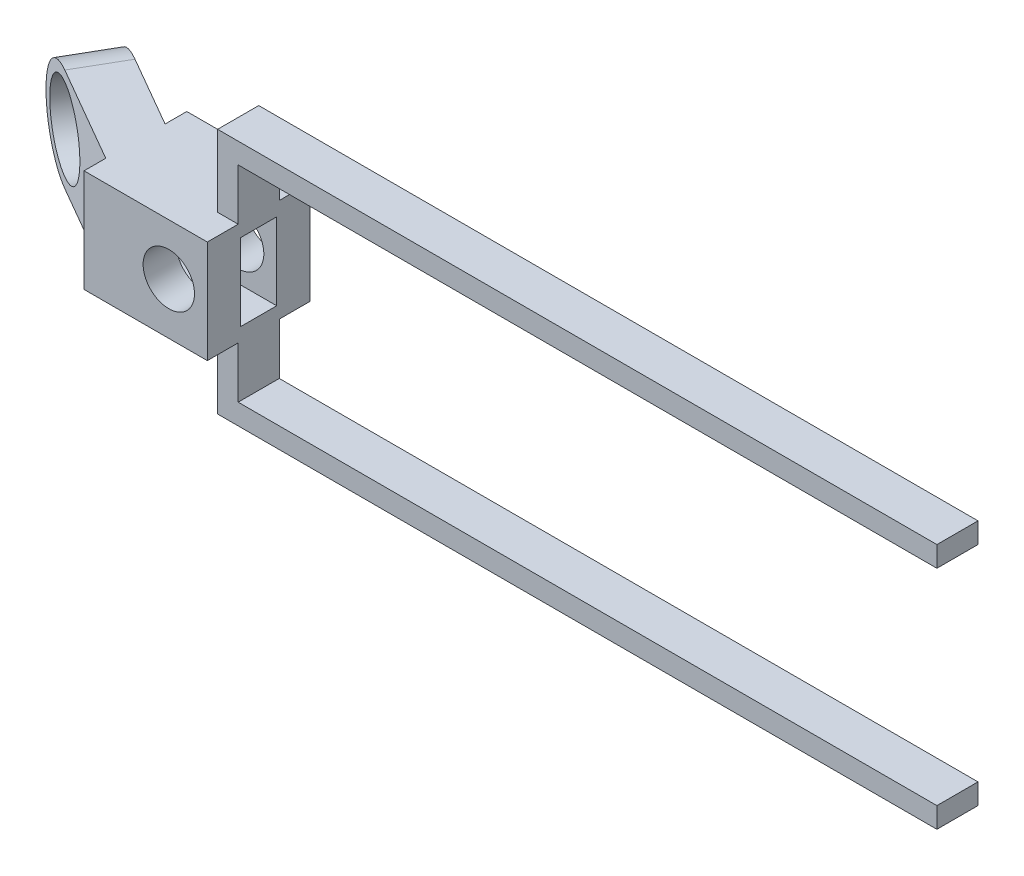
ISO-10303-21;
HEADER;
FILE_DESCRIPTION(('STEP AP214'),'2;1');
FILE_NAME('part.step','',(''),(''),'','','');
FILE_SCHEMA(('AUTOMOTIVE_DESIGN { 1 0 10303 214 1 1 1 1 }'));
ENDSEC;
DATA;
#1=APPLICATION_CONTEXT('core data for automotive mechanical design processes');
#2=APPLICATION_PROTOCOL_DEFINITION('international standard','automotive_design',2000,#1);
#3=PRODUCT_CONTEXT('',#1,'mechanical');
#4=PRODUCT('Part','Part','',(#3));
#5=PRODUCT_RELATED_PRODUCT_CATEGORY('part','',(#4));
#6=PRODUCT_DEFINITION_FORMATION('','',#4);
#7=PRODUCT_DEFINITION_CONTEXT('part definition',#1,'design');
#8=PRODUCT_DEFINITION('design','',#6,#7);
#9=PRODUCT_DEFINITION_SHAPE('','',#8);
#10=(LENGTH_UNIT() NAMED_UNIT(*) SI_UNIT(.MILLI.,.METRE.));
#11=(NAMED_UNIT(*) PLANE_ANGLE_UNIT() SI_UNIT($,.RADIAN.));
#12=(NAMED_UNIT(*) SI_UNIT($,.STERADIAN.) SOLID_ANGLE_UNIT());
#13=UNCERTAINTY_MEASURE_WITH_UNIT(LENGTH_MEASURE(1.E-05),#10,'distance_accuracy_value','');
#14=(GEOMETRIC_REPRESENTATION_CONTEXT(3) GLOBAL_UNCERTAINTY_ASSIGNED_CONTEXT((#13)) GLOBAL_UNIT_ASSIGNED_CONTEXT((#10,
#11,#12)) REPRESENTATION_CONTEXT('',''));
#15=CARTESIAN_POINT('',(0.,0.,0.));
#16=DIRECTION('',(0.,0.,1.));
#17=DIRECTION('',(1.,0.,0.));
#18=AXIS2_PLACEMENT_3D('',#15,#16,#17);
#19=CARTESIAN_POINT('',(2.54000000000001,0.,0.));
#20=DIRECTION('',(1.,0.,0.));
#21=DIRECTION('',(0.,1.,0.));
#22=AXIS2_PLACEMENT_3D('',#19,#20,#21);
#23=PLANE('',#22);
#24=DIRECTION('',(0.,0.,1.));
#25=VECTOR('',#24,1.);
#26=CARTESIAN_POINT('',(2.54000000000001,11.1125,8.5725));
#27=LINE('',#26,#25);
#28=CARTESIAN_POINT('',(2.54000000000001,11.1125,4.1275));
#29=VERTEX_POINT('',#28);
#30=CARTESIAN_POINT('',(2.54000000000001,11.1125,4.15029547438753));
#31=VERTEX_POINT('',#30);
#32=EDGE_CURVE('E333',#29,#31,#27,.T.);
#33=ORIENTED_EDGE('',*,*,#32,.T.);
#34=DIRECTION('',(0.,-1.,0.));
#35=VECTOR('',#34,1.);
#36=CARTESIAN_POINT('',(2.54000000000001,0.,4.15029547438752));
#37=LINE('',#36,#35);
#38=CARTESIAN_POINT('',(2.54000000000001,1.5875,4.15029547438753));
#39=VERTEX_POINT('',#38);
#40=EDGE_CURVE('E274',#31,#39,#37,.T.);
#41=ORIENTED_EDGE('',*,*,#40,.T.);
#42=DIRECTION('',(0.,0.,-1.));
#43=VECTOR('',#42,1.);
#44=CARTESIAN_POINT('',(2.54000000000001,1.5875,8.5725));
#45=LINE('',#44,#43);
#46=CARTESIAN_POINT('',(2.54000000000001,1.5875,4.1275));
#47=VERTEX_POINT('',#46);
#48=EDGE_CURVE('E322',#39,#47,#45,.T.);
#49=ORIENTED_EDGE('',*,*,#48,.T.);
#50=DIRECTION('',(0.,1.,0.));
#51=VECTOR('',#50,1.);
#52=CARTESIAN_POINT('',(2.54000000000001,11.1125,4.1275));
#53=LINE('',#52,#51);
#54=EDGE_CURVE('E328',#47,#29,#53,.T.);
#55=ORIENTED_EDGE('',*,*,#54,.T.);
#56=EDGE_LOOP('',(#33,#41,#49,#55));
#57=FACE_BOUND('',#56,.T.);
#58=ADVANCED_FACE('F47',(#57),#23,.T.);
#59=CARTESIAN_POINT('',(0.,0.,12.7));
#60=DIRECTION('',(-1.,0.,0.));
#61=DIRECTION('',(0.,0.,1.));
#62=AXIS2_PLACEMENT_3D('',#59,#60,#61);
#63=PLANE('',#62);
#64=DIRECTION('',(0.,0.,-1.));
#65=VECTOR('',#64,1.);
#66=CARTESIAN_POINT('',(0.,0.,12.7));
#67=LINE('',#66,#65);
#68=CARTESIAN_POINT('',(0.,0.,2.68382579064589));
#69=VERTEX_POINT('',#68);
#70=CARTESIAN_POINT('',(0.,0.,0.));
#71=VERTEX_POINT('',#70);
#72=EDGE_CURVE('E469',#69,#71,#67,.T.);
#73=ORIENTED_EDGE('',*,*,#72,.F.);
#74=DIRECTION('',(0.,1.,0.));
#75=VECTOR('',#74,1.);
#76=CARTESIAN_POINT('',(0.,0.,2.68382579064589));
#77=LINE('',#76,#75);
#78=CARTESIAN_POINT('',(0.,12.7,2.68382579064589));
#79=VERTEX_POINT('',#78);
#80=EDGE_CURVE('E72',#69,#79,#77,.T.);
#81=ORIENTED_EDGE('',*,*,#80,.T.);
#82=DIRECTION('',(0.,0.,-1.));
#83=VECTOR('',#82,1.);
#84=CARTESIAN_POINT('',(0.,12.7,12.7));
#85=LINE('',#84,#83);
#86=CARTESIAN_POINT('',(0.,12.7,0.));
#87=VERTEX_POINT('',#86);
#88=EDGE_CURVE('E485',#79,#87,#85,.T.);
#89=ORIENTED_EDGE('',*,*,#88,.T.);
#90=DIRECTION('',(0.,1.,0.));
#91=VECTOR('',#90,1.);
#92=CARTESIAN_POINT('',(0.,0.,0.));
#93=LINE('',#92,#91);
#94=EDGE_CURVE('E458',#71,#87,#93,.T.);
#95=ORIENTED_EDGE('',*,*,#94,.F.);
#96=EDGE_LOOP('',(#73,#81,#89,#95));
#97=FACE_BOUND('',#96,.T.);
#98=ADVANCED_FACE('F589',(#97),#63,.T.);
#99=CARTESIAN_POINT('',(12.7,0.,12.7));
#100=DIRECTION('',(-1.,0.,0.));
#101=DIRECTION('',(0.,-1.,0.));
#102=AXIS2_PLACEMENT_3D('',#99,#100,#101);
#103=PLANE('',#102);
#104=DIRECTION('',(0.,0.,-1.));
#105=VECTOR('',#104,1.);
#106=CARTESIAN_POINT('',(12.7,0.,12.7));
#107=LINE('',#106,#105);
#108=CARTESIAN_POINT('',(12.7,0.,8.89000000000001));
#109=VERTEX_POINT('',#108);
#110=CARTESIAN_POINT('',(12.7,0.,3.81));
#111=VERTEX_POINT('',#110);
#112=EDGE_CURVE('E526',#109,#111,#107,.T.);
#113=ORIENTED_EDGE('',*,*,#112,.T.);
#114=DIRECTION('',(0.,-1.,0.));
#115=VECTOR('',#114,1.);
#116=CARTESIAN_POINT('',(12.7,0.,3.81));
#117=LINE('',#116,#115);
#118=CARTESIAN_POINT('',(12.7,-8.89000000000001,3.81));
#119=VERTEX_POINT('',#118);
#120=EDGE_CURVE('E354',#111,#119,#117,.T.);
#121=ORIENTED_EDGE('',*,*,#120,.T.);
#122=DIRECTION('',(0.,0.,-1.));
#123=VECTOR('',#122,1.);
#124=CARTESIAN_POINT('',(12.7,-8.89000000000001,12.7));
#125=LINE('',#124,#123);
#126=CARTESIAN_POINT('',(12.7,-8.89000000000001,8.89000000000001));
#127=VERTEX_POINT('',#126);
#128=EDGE_CURVE('E522',#127,#119,#125,.T.);
#129=ORIENTED_EDGE('',*,*,#128,.F.);
#130=DIRECTION('',(0.,-1.,0.));
#131=VECTOR('',#130,1.);
#132=CARTESIAN_POINT('',(12.7,0.,8.89));
#133=LINE('',#132,#131);
#134=EDGE_CURVE('E385',#109,#127,#133,.T.);
#135=ORIENTED_EDGE('',*,*,#134,.F.);
#136=EDGE_LOOP('',(#113,#121,#129,#135));
#137=FACE_BOUND('',#136,.T.);
#138=ADVANCED_FACE('F595',(#137),#103,.T.);
#139=CARTESIAN_POINT('',(0.,-8.89000000000001,12.7));
#140=DIRECTION('',(0.,-1.,0.));
#141=DIRECTION('',(1.,0.,0.));
#142=AXIS2_PLACEMENT_3D('',#139,#140,#141);
#143=PLANE('',#142);
#144=ORIENTED_EDGE('',*,*,#128,.T.);
#145=DIRECTION('',(-1.,0.,0.));
#146=VECTOR('',#145,1.);
#147=CARTESIAN_POINT('',(101.6,-8.89000000000001,3.81));
#148=LINE('',#147,#146);
#149=CARTESIAN_POINT('',(101.6,-8.89000000000001,3.81));
#150=VERTEX_POINT('',#149);
#151=EDGE_CURVE('E388',#150,#119,#148,.T.);
#152=ORIENTED_EDGE('',*,*,#151,.F.);
#153=DIRECTION('',(0.,0.,-1.));
#154=VECTOR('',#153,1.);
#155=CARTESIAN_POINT('',(101.6,-8.89000000000003,12.7));
#156=LINE('',#155,#154);
#157=CARTESIAN_POINT('',(101.6,-8.89000000000001,8.89000000000001));
#158=VERTEX_POINT('',#157);
#159=EDGE_CURVE('E518',#158,#150,#156,.T.);
#160=ORIENTED_EDGE('',*,*,#159,.F.);
#161=DIRECTION('',(-1.,0.,0.));
#162=VECTOR('',#161,1.);
#163=CARTESIAN_POINT('',(101.6,-8.89000000000001,8.89000000000001));
#164=LINE('',#163,#162);
#165=EDGE_CURVE('E373',#158,#127,#164,.T.);
#166=ORIENTED_EDGE('',*,*,#165,.T.);
#167=EDGE_LOOP('',(#144,#152,#160,#166));
#168=FACE_BOUND('',#167,.T.);
#169=ADVANCED_FACE('F635',(#168),#143,.T.);
#170=CARTESIAN_POINT('',(101.6,0.,12.7));
#171=DIRECTION('',(-1.,0.,0.));
#172=DIRECTION('',(0.,-1.,0.));
#173=AXIS2_PLACEMENT_3D('',#170,#171,#172);
#174=PLANE('',#173);
#175=DIRECTION('',(0.,-1.,0.));
#176=VECTOR('',#175,1.);
#177=CARTESIAN_POINT('',(101.6,0.,3.81));
#178=LINE('',#177,#176);
#179=CARTESIAN_POINT('',(101.6,-6.35000000000004,3.81));
#180=VERTEX_POINT('',#179);
#181=EDGE_CURVE('E394',#180,#150,#178,.T.);
#182=ORIENTED_EDGE('',*,*,#181,.F.);
#183=DIRECTION('',(0.,0.,-1.));
#184=VECTOR('',#183,1.);
#185=CARTESIAN_POINT('',(101.6,-6.35000000000004,12.7));
#186=LINE('',#185,#184);
#187=CARTESIAN_POINT('',(101.6,-6.35000000000004,8.89));
#188=VERTEX_POINT('',#187);
#189=EDGE_CURVE('E514',#188,#180,#186,.T.);
#190=ORIENTED_EDGE('',*,*,#189,.F.);
#191=DIRECTION('',(0.,-1.,0.));
#192=VECTOR('',#191,1.);
#193=CARTESIAN_POINT('',(101.6,0.,8.89));
#194=LINE('',#193,#192);
#195=EDGE_CURVE('E380',#188,#158,#194,.T.);
#196=ORIENTED_EDGE('',*,*,#195,.T.);
#197=ORIENTED_EDGE('',*,*,#159,.T.);
#198=EDGE_LOOP('',(#182,#190,#196,#197));
#199=FACE_BOUND('',#198,.T.);
#200=ADVANCED_FACE('F643',(#199),#174,.F.);
#201=CARTESIAN_POINT('',(0.,-6.35000000000002,12.7));
#202=DIRECTION('',(0.,1.,0.));
#203=DIRECTION('',(-1.,0.,0.));
#204=AXIS2_PLACEMENT_3D('',#201,#202,#203);
#205=PLANE('',#204);
#206=ORIENTED_EDGE('',*,*,#189,.T.);
#207=DIRECTION('',(-1.,0.,0.));
#208=VECTOR('',#207,1.);
#209=CARTESIAN_POINT('',(0.,-6.35000000000002,3.81));
#210=LINE('',#209,#208);
#211=CARTESIAN_POINT('',(15.24,-6.35000000000002,3.81));
#212=VERTEX_POINT('',#211);
#213=EDGE_CURVE('E449',#180,#212,#210,.T.);
#214=ORIENTED_EDGE('',*,*,#213,.T.);
#215=DIRECTION('',(0.,0.,-1.));
#216=VECTOR('',#215,1.);
#217=CARTESIAN_POINT('',(15.24,-6.35000000000002,12.7));
#218=LINE('',#217,#216);
#219=CARTESIAN_POINT('',(15.24,-6.35000000000002,8.89));
#220=VERTEX_POINT('',#219);
#221=EDGE_CURVE('E510',#220,#212,#218,.T.);
#222=ORIENTED_EDGE('',*,*,#221,.F.);
#223=DIRECTION('',(-1.,0.,0.));
#224=VECTOR('',#223,1.);
#225=CARTESIAN_POINT('',(0.,-6.35000000000002,8.89000000000001));
#226=LINE('',#225,#224);
#227=EDGE_CURVE('E446',#188,#220,#226,.T.);
#228=ORIENTED_EDGE('',*,*,#227,.F.);
#229=EDGE_LOOP('',(#206,#214,#222,#228));
#230=FACE_BOUND('',#229,.T.);
#231=ADVANCED_FACE('F646',(#230),#205,.T.);
#232=CARTESIAN_POINT('',(15.24,0.,12.7));
#233=DIRECTION('',(1.,0.,0.));
#234=DIRECTION('',(0.,1.,0.));
#235=AXIS2_PLACEMENT_3D('',#232,#233,#234);
#236=PLANE('',#235);
#237=DIRECTION('',(0.,-1.,0.));
#238=VECTOR('',#237,1.);
#239=CARTESIAN_POINT('',(15.24,11.1125,8.5725));
#240=LINE('',#239,#238);
#241=CARTESIAN_POINT('',(15.24,11.1125,8.5725));
#242=VERTEX_POINT('',#241);
#243=CARTESIAN_POINT('',(15.24,1.5875,8.5725));
#244=VERTEX_POINT('',#243);
#245=EDGE_CURVE('E317',#242,#244,#240,.T.);
#246=ORIENTED_EDGE('',*,*,#245,.F.);
#247=DIRECTION('',(0.,0.,1.));
#248=VECTOR('',#247,1.);
#249=CARTESIAN_POINT('',(15.24,11.1125,8.5725));
#250=LINE('',#249,#248);
#251=CARTESIAN_POINT('',(15.24,11.1125,4.1275));
#252=VERTEX_POINT('',#251);
#253=EDGE_CURVE('E323',#252,#242,#250,.T.);
#254=ORIENTED_EDGE('',*,*,#253,.F.);
#255=DIRECTION('',(0.,1.,0.));
#256=VECTOR('',#255,1.);
#257=CARTESIAN_POINT('',(15.24,11.1125,4.1275));
#258=LINE('',#257,#256);
#259=CARTESIAN_POINT('',(15.24,1.5875,4.1275));
#260=VERTEX_POINT('',#259);
#261=EDGE_CURVE('E344',#260,#252,#258,.T.);
#262=ORIENTED_EDGE('',*,*,#261,.F.);
#263=DIRECTION('',(0.,0.,-1.));
#264=VECTOR('',#263,1.);
#265=CARTESIAN_POINT('',(15.24,1.5875,8.5725));
#266=LINE('',#265,#264);
#267=EDGE_CURVE('E340',#244,#260,#266,.T.);
#268=ORIENTED_EDGE('',*,*,#267,.F.);
#269=EDGE_LOOP('',(#246,#254,#262,#268));
#270=FACE_BOUND('',#269,.T.);
#271=ORIENTED_EDGE('',*,*,#221,.T.);
#272=DIRECTION('',(0.,1.,0.));
#273=VECTOR('',#272,1.);
#274=CARTESIAN_POINT('',(15.24,0.,3.81));
#275=LINE('',#274,#273);
#276=CARTESIAN_POINT('',(15.24,0.,3.81));
#277=VERTEX_POINT('',#276);
#278=EDGE_CURVE('E11',#212,#277,#275,.T.);
#279=ORIENTED_EDGE('',*,*,#278,.T.);
#280=DIRECTION('',(0.,0.,1.));
#281=VECTOR('',#280,1.);
#282=CARTESIAN_POINT('',(15.24,0.,12.7));
#283=LINE('',#282,#281);
#284=CARTESIAN_POINT('',(15.24,0.,0.));
#285=VERTEX_POINT('',#284);
#286=EDGE_CURVE('E422',#285,#277,#283,.T.);
#287=ORIENTED_EDGE('',*,*,#286,.F.);
#288=DIRECTION('',(0.,-1.,0.));
#289=VECTOR('',#288,1.);
#290=CARTESIAN_POINT('',(15.24,0.,0.));
#291=LINE('',#290,#289);
#292=CARTESIAN_POINT('',(15.24,12.7,0.));
#293=VERTEX_POINT('',#292);
#294=EDGE_CURVE('E472',#293,#285,#291,.T.);
#295=ORIENTED_EDGE('',*,*,#294,.F.);
#296=DIRECTION('',(0.,0.,-1.));
#297=VECTOR('',#296,1.);
#298=CARTESIAN_POINT('',(15.24,12.7,12.7));
#299=LINE('',#298,#297);
#300=CARTESIAN_POINT('',(15.24,12.7,3.81));
#301=VERTEX_POINT('',#300);
#302=EDGE_CURVE('E416',#301,#293,#299,.T.);
#303=ORIENTED_EDGE('',*,*,#302,.F.);
#304=DIRECTION('',(0.,1.,0.));
#305=VECTOR('',#304,1.);
#306=CARTESIAN_POINT('',(15.24,0.,3.81));
#307=LINE('',#306,#305);
#308=CARTESIAN_POINT('',(15.24,19.05,3.81));
#309=VERTEX_POINT('',#308);
#310=EDGE_CURVE('E435',#301,#309,#307,.T.);
#311=ORIENTED_EDGE('',*,*,#310,.T.);
#312=DIRECTION('',(0.,0.,-1.));
#313=VECTOR('',#312,1.);
#314=CARTESIAN_POINT('',(15.24,19.05,12.7));
#315=LINE('',#314,#313);
#316=CARTESIAN_POINT('',(15.24,19.05,8.89));
#317=VERTEX_POINT('',#316);
#318=EDGE_CURVE('E506',#317,#309,#315,.T.);
#319=ORIENTED_EDGE('',*,*,#318,.F.);
#320=DIRECTION('',(0.,1.,0.));
#321=VECTOR('',#320,1.);
#322=CARTESIAN_POINT('',(15.24,0.,8.89));
#323=LINE('',#322,#321);
#324=CARTESIAN_POINT('',(15.24,12.7,8.89));
#325=VERTEX_POINT('',#324);
#326=EDGE_CURVE('E443',#325,#317,#323,.T.);
#327=ORIENTED_EDGE('',*,*,#326,.F.);
#328=DIRECTION('',(0.,0.,-1.));
#329=VECTOR('',#328,1.);
#330=CARTESIAN_POINT('',(15.24,12.7,12.7));
#331=LINE('',#330,#329);
#332=CARTESIAN_POINT('',(15.24,12.7,12.7));
#333=VERTEX_POINT('',#332);
#334=EDGE_CURVE('E425',#333,#325,#331,.T.);
#335=ORIENTED_EDGE('',*,*,#334,.F.);
#336=DIRECTION('',(0.,-1.,0.));
#337=VECTOR('',#336,1.);
#338=CARTESIAN_POINT('',(15.24,0.,12.7));
#339=LINE('',#338,#337);
#340=CARTESIAN_POINT('',(15.24,0.,12.7));
#341=VERTEX_POINT('',#340);
#342=EDGE_CURVE('E457',#333,#341,#339,.T.);
#343=ORIENTED_EDGE('',*,*,#342,.T.);
#344=DIRECTION('',(0.,0.,1.));
#345=VECTOR('',#344,1.);
#346=CARTESIAN_POINT('',(15.24,0.,12.7));
#347=LINE('',#346,#345);
#348=CARTESIAN_POINT('',(15.24,0.,8.89000000000001));
#349=VERTEX_POINT('',#348);
#350=EDGE_CURVE('E428',#349,#341,#347,.T.);
#351=ORIENTED_EDGE('',*,*,#350,.F.);
#352=DIRECTION('',(0.,1.,0.));
#353=VECTOR('',#352,1.);
#354=CARTESIAN_POINT('',(15.24,0.,8.89));
#355=LINE('',#354,#353);
#356=EDGE_CURVE('E57',#220,#349,#355,.T.);
#357=ORIENTED_EDGE('',*,*,#356,.F.);
#358=EDGE_LOOP('',(#271,#279,#287,#295,#303,#311,#319,#327,#335,#343,#351,#357));
#359=FACE_BOUND('',#358,.T.);
#360=ADVANCED_FACE('F542',(#270,#359),#236,.T.);
#361=CARTESIAN_POINT('',(0.,19.05,12.7));
#362=DIRECTION('',(0.,1.,0.));
#363=DIRECTION('',(-1.,0.,0.));
#364=AXIS2_PLACEMENT_3D('',#361,#362,#363);
#365=PLANE('',#364);
#366=DIRECTION('',(0.,0.,-1.));
#367=VECTOR('',#366,1.);
#368=CARTESIAN_POINT('',(101.6,19.05,12.7));
#369=LINE('',#368,#367);
#370=CARTESIAN_POINT('',(101.6,19.05,8.89));
#371=VERTEX_POINT('',#370);
#372=CARTESIAN_POINT('',(101.6,19.05,3.81));
#373=VERTEX_POINT('',#372);
#374=EDGE_CURVE('E502',#371,#373,#369,.T.);
#375=ORIENTED_EDGE('',*,*,#374,.F.);
#376=DIRECTION('',(-1.,0.,0.));
#377=VECTOR('',#376,1.);
#378=CARTESIAN_POINT('',(0.,19.05,8.89));
#379=LINE('',#378,#377);
#380=EDGE_CURVE('E439',#371,#317,#379,.T.);
#381=ORIENTED_EDGE('',*,*,#380,.T.);
#382=ORIENTED_EDGE('',*,*,#318,.T.);
#383=DIRECTION('',(-1.,0.,0.));
#384=VECTOR('',#383,1.);
#385=CARTESIAN_POINT('',(0.,19.05,3.81));
#386=LINE('',#385,#384);
#387=EDGE_CURVE('E432',#373,#309,#386,.T.);
#388=ORIENTED_EDGE('',*,*,#387,.F.);
#389=EDGE_LOOP('',(#375,#381,#382,#388));
#390=FACE_BOUND('',#389,.T.);
#391=ADVANCED_FACE('F648',(#390),#365,.F.);
#392=DIRECTION('',(0.,0.,-1.));
#393=VECTOR('',#392,1.);
#394=CARTESIAN_POINT('',(101.6,21.59,12.7));
#395=LINE('',#394,#393);
#396=CARTESIAN_POINT('',(101.6,21.59,8.89));
#397=VERTEX_POINT('',#396);
#398=CARTESIAN_POINT('',(101.6,21.59,3.81));
#399=VERTEX_POINT('',#398);
#400=EDGE_CURVE('E498',#397,#399,#395,.T.);
#401=ORIENTED_EDGE('',*,*,#400,.F.);
#402=DIRECTION('',(0.,-1.,0.));
#403=VECTOR('',#402,1.);
#404=CARTESIAN_POINT('',(101.6,0.,8.89));
#405=LINE('',#404,#403);
#406=EDGE_CURVE('E364',#397,#371,#405,.T.);
#407=ORIENTED_EDGE('',*,*,#406,.T.);
#408=ORIENTED_EDGE('',*,*,#374,.T.);
#409=DIRECTION('',(0.,-1.,0.));
#410=VECTOR('',#409,1.);
#411=CARTESIAN_POINT('',(101.6,0.,3.81));
#412=LINE('',#411,#410);
#413=EDGE_CURVE('E405',#399,#373,#412,.T.);
#414=ORIENTED_EDGE('',*,*,#413,.F.);
#415=EDGE_LOOP('',(#401,#407,#408,#414));
#416=FACE_BOUND('',#415,.T.);
#417=ADVANCED_FACE('F641',(#416),#174,.F.);
#418=CARTESIAN_POINT('',(0.,21.59,12.7));
#419=DIRECTION('',(0.,-1.,0.));
#420=DIRECTION('',(1.,0.,0.));
#421=AXIS2_PLACEMENT_3D('',#418,#419,#420);
#422=PLANE('',#421);
#423=DIRECTION('',(0.,0.,-1.));
#424=VECTOR('',#423,1.);
#425=CARTESIAN_POINT('',(12.7,21.59,12.7));
#426=LINE('',#425,#424);
#427=CARTESIAN_POINT('',(12.7,21.59,8.89));
#428=VERTEX_POINT('',#427);
#429=CARTESIAN_POINT('',(12.7,21.59,3.81));
#430=VERTEX_POINT('',#429);
#431=EDGE_CURVE('E494',#428,#430,#426,.T.);
#432=ORIENTED_EDGE('',*,*,#431,.F.);
#433=DIRECTION('',(-1.,0.,0.));
#434=VECTOR('',#433,1.);
#435=CARTESIAN_POINT('',(101.6,21.59,8.89));
#436=LINE('',#435,#434);
#437=EDGE_CURVE('E374',#397,#428,#436,.T.);
#438=ORIENTED_EDGE('',*,*,#437,.F.);
#439=ORIENTED_EDGE('',*,*,#400,.T.);
#440=DIRECTION('',(-1.,0.,0.));
#441=VECTOR('',#440,1.);
#442=CARTESIAN_POINT('',(101.6,21.59,3.81));
#443=LINE('',#442,#441);
#444=EDGE_CURVE('E412',#399,#430,#443,.T.);
#445=ORIENTED_EDGE('',*,*,#444,.T.);
#446=EDGE_LOOP('',(#432,#438,#439,#445));
#447=FACE_BOUND('',#446,.T.);
#448=ADVANCED_FACE('F638',(#447),#422,.F.);
#449=DIRECTION('',(0.,-1.,0.));
#450=VECTOR('',#449,1.);
#451=CARTESIAN_POINT('',(12.7,0.,8.89));
#452=LINE('',#451,#450);
#453=CARTESIAN_POINT('',(12.7,12.7,8.89));
#454=VERTEX_POINT('',#453);
#455=EDGE_CURVE('E369',#428,#454,#452,.T.);
#456=ORIENTED_EDGE('',*,*,#455,.F.);
#457=ORIENTED_EDGE('',*,*,#431,.T.);
#458=DIRECTION('',(0.,-1.,0.));
#459=VECTOR('',#458,1.);
#460=CARTESIAN_POINT('',(12.7,0.,3.81));
#461=LINE('',#460,#459);
#462=CARTESIAN_POINT('',(12.7,12.7,3.81));
#463=VERTEX_POINT('',#462);
#464=EDGE_CURVE('E377',#430,#463,#461,.T.);
#465=ORIENTED_EDGE('',*,*,#464,.T.);
#466=DIRECTION('',(0.,0.,-1.));
#467=VECTOR('',#466,1.);
#468=CARTESIAN_POINT('',(12.7,12.7,12.7));
#469=LINE('',#468,#467);
#470=EDGE_CURVE('E490',#454,#463,#469,.T.);
#471=ORIENTED_EDGE('',*,*,#470,.F.);
#472=EDGE_LOOP('',(#456,#457,#465,#471));
#473=FACE_BOUND('',#472,.T.);
#474=ADVANCED_FACE('F637',(#473),#103,.T.);
#475=CARTESIAN_POINT('',(0.,0.,12.7));
#476=DIRECTION('',(0.,1.,0.));
#477=DIRECTION('',(0.,0.,1.));
#478=AXIS2_PLACEMENT_3D('',#475,#476,#477);
#479=PLANE('',#478);
#480=CARTESIAN_POINT('',(0.,0.,12.7));
#481=VERTEX_POINT('',#480);
#482=CARTESIAN_POINT('',(0.,0.,10.0161742093541));
#483=VERTEX_POINT('',#482);
#484=EDGE_CURVE('E482',#481,#483,#67,.T.);
#485=ORIENTED_EDGE('',*,*,#484,.T.);
#486=DIRECTION('',(0.866025403784442,0.,0.499999999999995));
#487=VECTOR('',#486,1.);
#488=CARTESIAN_POINT('',(-3.17499999999995,0.,8.18308710467709));
#489=LINE('',#488,#487);
#490=CARTESIAN_POINT('',(-11.9738181024499,0.,3.10308710467714));
#491=VERTEX_POINT('',#490);
#492=EDGE_CURVE('E243',#491,#483,#489,.T.);
#493=ORIENTED_EDGE('',*,*,#492,.F.);
#494=DIRECTION('',(-0.499999999999995,0.,0.866025403784441));
#495=VECTOR('',#494,1.);
#496=CARTESIAN_POINT('',(-8.79881810244991,0.,-2.39617420935406));
#497=LINE('',#496,#495);
#498=CARTESIAN_POINT('',(-8.79881810244991,0.,-2.39617420935406));
#499=VERTEX_POINT('',#498);
#500=EDGE_CURVE('E241',#499,#491,#497,.T.);
#501=ORIENTED_EDGE('',*,*,#500,.F.);
#502=DIRECTION('',(-0.866025403784442,0.,-0.499999999999995));
#503=VECTOR('',#502,1.);
#504=CARTESIAN_POINT('',(-1.16213065701559,0.,2.01286934298443));
#505=LINE('',#504,#503);
#506=EDGE_CURVE('E229',#69,#499,#505,.T.);
#507=ORIENTED_EDGE('',*,*,#506,.F.);
#508=ORIENTED_EDGE('',*,*,#72,.T.);
#509=DIRECTION('',(1.,0.,0.));
#510=VECTOR('',#509,1.);
#511=CARTESIAN_POINT('',(0.,0.,0.));
#512=LINE('',#511,#510);
#513=EDGE_CURVE('E453',#71,#285,#512,.T.);
#514=ORIENTED_EDGE('',*,*,#513,.T.);
#515=ORIENTED_EDGE('',*,*,#286,.T.);
#516=DIRECTION('',(-1.,0.,0.));
#517=VECTOR('',#516,1.);
#518=CARTESIAN_POINT('',(101.6,0.,3.81));
#519=LINE('',#518,#517);
#520=EDGE_CURVE('E397',#277,#111,#519,.T.);
#521=ORIENTED_EDGE('',*,*,#520,.T.);
#522=ORIENTED_EDGE('',*,*,#112,.F.);
#523=DIRECTION('',(-1.,0.,0.));
#524=VECTOR('',#523,1.);
#525=CARTESIAN_POINT('',(101.6,0.,8.89000000000001));
#526=LINE('',#525,#524);
#527=EDGE_CURVE('E384',#349,#109,#526,.T.);
#528=ORIENTED_EDGE('',*,*,#527,.F.);
#529=ORIENTED_EDGE('',*,*,#350,.T.);
#530=DIRECTION('',(1.,0.,0.));
#531=VECTOR('',#530,1.);
#532=CARTESIAN_POINT('',(0.,0.,12.7));
#533=LINE('',#532,#531);
#534=EDGE_CURVE('E454',#481,#341,#533,.T.);
#535=ORIENTED_EDGE('',*,*,#534,.F.);
#536=EDGE_LOOP('',(#485,#493,#501,#507,#508,#514,#515,#521,#522,#528,#529,#535));
#537=FACE_BOUND('',#536,.T.);
#538=ADVANCED_FACE('F49',(#537),#479,.F.);
#539=CARTESIAN_POINT('',(0.,12.7,12.7));
#540=DIRECTION('',(0.,1.,0.));
#541=DIRECTION('',(-1.,0.,0.));
#542=AXIS2_PLACEMENT_3D('',#539,#540,#541);
#543=PLANE('',#542);
#544=DIRECTION('',(0.866025403784442,0.,0.499999999999995));
#545=VECTOR('',#544,1.);
#546=CARTESIAN_POINT('',(-3.17499999999997,12.7,8.18308710467709));
#547=LINE('',#546,#545);
#548=CARTESIAN_POINT('',(-11.9738181024499,12.7,3.10308710467715));
#549=VERTEX_POINT('',#548);
#550=CARTESIAN_POINT('',(0.,12.7,10.0161742093541));
#551=VERTEX_POINT('',#550);
#552=EDGE_CURVE('E294',#549,#551,#547,.T.);
#553=ORIENTED_EDGE('',*,*,#552,.T.);
#554=CARTESIAN_POINT('',(0.,12.7,12.7));
#555=VERTEX_POINT('',#554);
#556=EDGE_CURVE('E486',#555,#551,#85,.T.);
#557=ORIENTED_EDGE('',*,*,#556,.F.);
#558=DIRECTION('',(1.,0.,0.));
#559=VECTOR('',#558,1.);
#560=CARTESIAN_POINT('',(0.,12.7,12.7));
#561=LINE('',#560,#559);
#562=EDGE_CURVE('E462',#555,#333,#561,.T.);
#563=ORIENTED_EDGE('',*,*,#562,.T.);
#564=ORIENTED_EDGE('',*,*,#334,.T.);
#565=DIRECTION('',(-1.,0.,0.));
#566=VECTOR('',#565,1.);
#567=CARTESIAN_POINT('',(101.6,12.7,8.89));
#568=LINE('',#567,#566);
#569=EDGE_CURVE('E368',#325,#454,#568,.T.);
#570=ORIENTED_EDGE('',*,*,#569,.T.);
#571=ORIENTED_EDGE('',*,*,#470,.T.);
#572=DIRECTION('',(-1.,0.,0.));
#573=VECTOR('',#572,1.);
#574=CARTESIAN_POINT('',(101.6,12.7,3.81));
#575=LINE('',#574,#573);
#576=EDGE_CURVE('E408',#301,#463,#575,.T.);
#577=ORIENTED_EDGE('',*,*,#576,.F.);
#578=ORIENTED_EDGE('',*,*,#302,.T.);
#579=DIRECTION('',(1.,0.,0.));
#580=VECTOR('',#579,1.);
#581=CARTESIAN_POINT('',(0.,12.7,0.));
#582=LINE('',#581,#580);
#583=EDGE_CURVE('E476',#87,#293,#582,.T.);
#584=ORIENTED_EDGE('',*,*,#583,.F.);
#585=ORIENTED_EDGE('',*,*,#88,.F.);
#586=DIRECTION('',(-0.866025403784442,0.,-0.499999999999995));
#587=VECTOR('',#586,1.);
#588=CARTESIAN_POINT('',(-1.1621306570156,12.7,2.01286934298443));
#589=LINE('',#588,#587);
#590=CARTESIAN_POINT('',(-8.79881810244992,12.7,-2.39617420935405));
#591=VERTEX_POINT('',#590);
#592=EDGE_CURVE('E249',#79,#591,#589,.T.);
#593=ORIENTED_EDGE('',*,*,#592,.T.);
#594=DIRECTION('',(-0.499999999999995,0.,0.866025403784441));
#595=VECTOR('',#594,1.);
#596=CARTESIAN_POINT('',(-8.79881810244992,12.7,-2.39617420935405));
#597=LINE('',#596,#595);
#598=EDGE_CURVE('E248',#591,#549,#597,.T.);
#599=ORIENTED_EDGE('',*,*,#598,.T.);
#600=EDGE_LOOP('',(#553,#557,#563,#564,#570,#571,#577,#578,#584,#585,#593,#599));
#601=FACE_BOUND('',#600,.T.);
#602=ADVANCED_FACE('F557',(#601),#543,.T.);
#603=DIRECTION('',(0.,1.,0.));
#604=VECTOR('',#603,1.);
#605=CARTESIAN_POINT('',(0.,0.,10.0161742093541));
#606=LINE('',#605,#604);
#607=EDGE_CURVE('E300',#483,#551,#606,.T.);
#608=ORIENTED_EDGE('',*,*,#607,.F.);
#609=ORIENTED_EDGE('',*,*,#484,.F.);
#610=DIRECTION('',(0.,1.,0.));
#611=VECTOR('',#610,1.);
#612=CARTESIAN_POINT('',(0.,0.,12.7));
#613=LINE('',#612,#611);
#614=EDGE_CURVE('E465',#481,#555,#613,.T.);
#615=ORIENTED_EDGE('',*,*,#614,.T.);
#616=ORIENTED_EDGE('',*,*,#556,.T.);
#617=EDGE_LOOP('',(#608,#609,#615,#616));
#618=FACE_BOUND('',#617,.T.);
#619=ADVANCED_FACE('F552',(#618),#63,.T.);
#620=CARTESIAN_POINT('',(0.,0.,12.7));
#621=DIRECTION('',(0.,0.,1.));
#622=DIRECTION('',(1.,0.,0.));
#623=AXIS2_PLACEMENT_3D('',#620,#621,#622);
#624=PLANE('',#623);
#625=CARTESIAN_POINT('',(10.4775,6.35,12.7));
#626=DIRECTION('',(0.,0.,1.));
#627=DIRECTION('',(1.,0.,0.));
#628=AXIS2_PLACEMENT_3D('',#625,#626,#627);
#629=CIRCLE('',#628,3.175);
#630=CARTESIAN_POINT('',(13.6525,6.35,12.7));
#631=VERTEX_POINT('',#630);
#632=EDGE_CURVE('E303',#631,#631,#629,.T.);
#633=ORIENTED_EDGE('',*,*,#632,.F.);
#634=EDGE_LOOP('',(#633));
#635=FACE_BOUND('',#634,.T.);
#636=ORIENTED_EDGE('',*,*,#534,.T.);
#637=ORIENTED_EDGE('',*,*,#342,.F.);
#638=ORIENTED_EDGE('',*,*,#562,.F.);
#639=ORIENTED_EDGE('',*,*,#614,.F.);
#640=EDGE_LOOP('',(#636,#637,#638,#639));
#641=FACE_BOUND('',#640,.T.);
#642=ADVANCED_FACE('F548',(#635,#641),#624,.T.);
#643=CARTESIAN_POINT('',(0.,0.,0.));
#644=DIRECTION('',(0.,0.,1.));
#645=DIRECTION('',(1.,0.,0.));
#646=AXIS2_PLACEMENT_3D('',#643,#644,#645);
#647=PLANE('',#646);
#648=CARTESIAN_POINT('',(10.4775,6.35,0.));
#649=DIRECTION('',(0.,0.,1.));
#650=DIRECTION('',(1.,0.,0.));
#651=AXIS2_PLACEMENT_3D('',#648,#649,#650);
#652=CIRCLE('',#651,3.175);
#653=CARTESIAN_POINT('',(13.6525,6.35,0.));
#654=VERTEX_POINT('',#653);
#655=EDGE_CURVE('E306',#654,#654,#652,.T.);
#656=ORIENTED_EDGE('',*,*,#655,.T.);
#657=EDGE_LOOP('',(#656));
#658=FACE_BOUND('',#657,.T.);
#659=ORIENTED_EDGE('',*,*,#294,.T.);
#660=ORIENTED_EDGE('',*,*,#513,.F.);
#661=ORIENTED_EDGE('',*,*,#94,.T.);
#662=ORIENTED_EDGE('',*,*,#583,.T.);
#663=EDGE_LOOP('',(#659,#660,#661,#662));
#664=FACE_BOUND('',#663,.T.);
#665=ADVANCED_FACE('F623',(#658,#664),#647,.F.);
#666=CARTESIAN_POINT('',(101.6,0.,3.81));
#667=DIRECTION('',(0.,0.,-1.));
#668=DIRECTION('',(0.,1.,0.));
#669=AXIS2_PLACEMENT_3D('',#666,#667,#668);
#670=PLANE('',#669);
#671=ORIENTED_EDGE('',*,*,#576,.T.);
#672=ORIENTED_EDGE('',*,*,#464,.F.);
#673=ORIENTED_EDGE('',*,*,#444,.F.);
#674=ORIENTED_EDGE('',*,*,#413,.T.);
#675=ORIENTED_EDGE('',*,*,#387,.T.);
#676=ORIENTED_EDGE('',*,*,#310,.F.);
#677=EDGE_LOOP('',(#671,#672,#673,#674,#675,#676));
#678=FACE_BOUND('',#677,.T.);
#679=ADVANCED_FACE('F619',(#678),#670,.T.);
#680=CARTESIAN_POINT('',(101.6,0.,3.81));
#681=DIRECTION('',(0.,0.,-1.));
#682=DIRECTION('',(0.,1.,0.));
#683=AXIS2_PLACEMENT_3D('',#680,#681,#682);
#684=PLANE('',#683);
#685=ORIENTED_EDGE('',*,*,#181,.T.);
#686=ORIENTED_EDGE('',*,*,#151,.T.);
#687=ORIENTED_EDGE('',*,*,#120,.F.);
#688=ORIENTED_EDGE('',*,*,#520,.F.);
#689=ORIENTED_EDGE('',*,*,#278,.F.);
#690=ORIENTED_EDGE('',*,*,#213,.F.);
#691=EDGE_LOOP('',(#685,#686,#687,#688,#689,#690));
#692=FACE_BOUND('',#691,.T.);
#693=ADVANCED_FACE('F613',(#692),#684,.T.);
#694=CARTESIAN_POINT('',(101.6,0.,8.89));
#695=DIRECTION('',(0.,0.,-1.));
#696=DIRECTION('',(0.,1.,0.));
#697=AXIS2_PLACEMENT_3D('',#694,#695,#696);
#698=PLANE('',#697);
#699=ORIENTED_EDGE('',*,*,#326,.T.);
#700=ORIENTED_EDGE('',*,*,#380,.F.);
#701=ORIENTED_EDGE('',*,*,#406,.F.);
#702=ORIENTED_EDGE('',*,*,#437,.T.);
#703=ORIENTED_EDGE('',*,*,#455,.T.);
#704=ORIENTED_EDGE('',*,*,#569,.F.);
#705=EDGE_LOOP('',(#699,#700,#701,#702,#703,#704));
#706=FACE_BOUND('',#705,.T.);
#707=ADVANCED_FACE('F610',(#706),#698,.F.);
#708=CARTESIAN_POINT('',(101.6,0.,8.89));
#709=DIRECTION('',(0.,0.,-1.));
#710=DIRECTION('',(0.,1.,0.));
#711=AXIS2_PLACEMENT_3D('',#708,#709,#710);
#712=PLANE('',#711);
#713=ORIENTED_EDGE('',*,*,#227,.T.);
#714=ORIENTED_EDGE('',*,*,#356,.T.);
#715=ORIENTED_EDGE('',*,*,#527,.T.);
#716=ORIENTED_EDGE('',*,*,#134,.T.);
#717=ORIENTED_EDGE('',*,*,#165,.F.);
#718=ORIENTED_EDGE('',*,*,#195,.F.);
#719=EDGE_LOOP('',(#713,#714,#715,#716,#717,#718));
#720=FACE_BOUND('',#719,.T.);
#721=ADVANCED_FACE('F534',(#720),#712,.F.);
#722=CARTESIAN_POINT('',(2.54000000000001,11.1125,8.5725));
#723=DIRECTION('',(0.,0.,1.));
#724=DIRECTION('',(1.,0.,0.));
#725=AXIS2_PLACEMENT_3D('',#722,#723,#724);
#726=PLANE('',#725);
#727=CARTESIAN_POINT('',(10.4775,6.35,8.5725));
#728=DIRECTION('',(0.,0.,1.));
#729=DIRECTION('',(1.,0.,0.));
#730=AXIS2_PLACEMENT_3D('',#727,#728,#729);
#731=CIRCLE('',#730,3.175);
#732=CARTESIAN_POINT('',(13.6525,6.35,8.5725));
#733=VERTEX_POINT('',#732);
#734=EDGE_CURVE('E313',#733,#733,#731,.T.);
#735=ORIENTED_EDGE('',*,*,#734,.T.);
#736=EDGE_LOOP('',(#735));
#737=FACE_BOUND('',#736,.T.);
#738=ORIENTED_EDGE('',*,*,#245,.T.);
#739=DIRECTION('',(1.,0.,0.));
#740=VECTOR('',#739,1.);
#741=CARTESIAN_POINT('',(2.54000000000001,1.5875,8.5725));
#742=LINE('',#741,#740);
#743=CARTESIAN_POINT('',(2.54000000000001,1.5875,8.5725));
#744=VERTEX_POINT('',#743);
#745=EDGE_CURVE('E337',#744,#244,#742,.T.);
#746=ORIENTED_EDGE('',*,*,#745,.F.);
#747=DIRECTION('',(0.,-1.,0.));
#748=VECTOR('',#747,1.);
#749=CARTESIAN_POINT('',(2.54000000000001,11.1125,8.5725));
#750=LINE('',#749,#748);
#751=CARTESIAN_POINT('',(2.54000000000001,11.1125,8.5725));
#752=VERTEX_POINT('',#751);
#753=EDGE_CURVE('E318',#752,#744,#750,.T.);
#754=ORIENTED_EDGE('',*,*,#753,.F.);
#755=DIRECTION('',(1.,0.,0.));
#756=VECTOR('',#755,1.);
#757=CARTESIAN_POINT('',(2.54000000000001,11.1125,8.5725));
#758=LINE('',#757,#756);
#759=EDGE_CURVE('E351',#752,#242,#758,.T.);
#760=ORIENTED_EDGE('',*,*,#759,.T.);
#761=EDGE_LOOP('',(#738,#746,#754,#760));
#762=FACE_BOUND('',#761,.T.);
#763=ADVANCED_FACE('F601',(#737,#762),#726,.F.);
#764=CARTESIAN_POINT('',(2.54000000000001,11.1125,8.5725));
#765=DIRECTION('',(0.,1.,0.));
#766=DIRECTION('',(-1.,0.,0.));
#767=AXIS2_PLACEMENT_3D('',#764,#765,#766);
#768=PLANE('',#767);
#769=CARTESIAN_POINT('',(2.54000000000001,11.1125,5.61676515812909));
#770=VERTEX_POINT('',#769);
#771=EDGE_CURVE('E332',#770,#752,#27,.T.);
#772=ORIENTED_EDGE('',*,*,#771,.F.);
#773=DIRECTION('',(0.499999999999995,0.,-0.866025403784442));
#774=VECTOR('',#773,1.);
#775=CARTESIAN_POINT('',(1.26012927004452,11.1125,7.83356628953229));
#776=LINE('',#775,#774);
#777=CARTESIAN_POINT('',(3.17499999999996,11.1125,4.51691289532291));
#778=VERTEX_POINT('',#777);
#779=EDGE_CURVE('E290',#770,#778,#776,.T.);
#780=ORIENTED_EDGE('',*,*,#779,.T.);
#781=DIRECTION('',(0.866025403784442,0.,0.499999999999995));
#782=VECTOR('',#781,1.);
#783=CARTESIAN_POINT('',(4.45487072995545,11.1125,5.25584660579063));
#784=LINE('',#783,#782);
#785=EDGE_CURVE('E280',#31,#778,#784,.T.);
#786=ORIENTED_EDGE('',*,*,#785,.F.);
#787=ORIENTED_EDGE('',*,*,#32,.F.);
#788=DIRECTION('',(1.,0.,0.));
#789=VECTOR('',#788,1.);
#790=CARTESIAN_POINT('',(2.54000000000001,11.1125,4.1275));
#791=LINE('',#790,#789);
#792=EDGE_CURVE('E355',#29,#252,#791,.T.);
#793=ORIENTED_EDGE('',*,*,#792,.T.);
#794=ORIENTED_EDGE('',*,*,#253,.T.);
#795=ORIENTED_EDGE('',*,*,#759,.F.);
#796=EDGE_LOOP('',(#772,#780,#786,#787,#793,#794,#795));
#797=FACE_BOUND('',#796,.T.);
#798=ADVANCED_FACE('F598',(#797),#768,.F.);
#799=CARTESIAN_POINT('',(2.54000000000001,11.1125,4.1275));
#800=DIRECTION('',(0.,0.,-1.));
#801=DIRECTION('',(-1.,0.,0.));
#802=AXIS2_PLACEMENT_3D('',#799,#800,#801);
#803=PLANE('',#802);
#804=CARTESIAN_POINT('',(10.4775,6.35,4.1275));
#805=DIRECTION('',(0.,0.,-1.));
#806=DIRECTION('',(-1.,0.,0.));
#807=AXIS2_PLACEMENT_3D('',#804,#805,#806);
#808=CIRCLE('',#807,3.175);
#809=CARTESIAN_POINT('',(7.3025,6.35,4.1275));
#810=VERTEX_POINT('',#809);
#811=EDGE_CURVE('E51',#810,#810,#808,.T.);
#812=ORIENTED_EDGE('',*,*,#811,.T.);
#813=EDGE_LOOP('',(#812));
#814=FACE_BOUND('',#813,.T.);
#815=ORIENTED_EDGE('',*,*,#261,.T.);
#816=ORIENTED_EDGE('',*,*,#792,.F.);
#817=ORIENTED_EDGE('',*,*,#54,.F.);
#818=DIRECTION('',(1.,0.,0.));
#819=VECTOR('',#818,1.);
#820=CARTESIAN_POINT('',(2.54000000000001,1.5875,4.1275));
#821=LINE('',#820,#819);
#822=EDGE_CURVE('E358',#47,#260,#821,.T.);
#823=ORIENTED_EDGE('',*,*,#822,.T.);
#824=EDGE_LOOP('',(#815,#816,#817,#823));
#825=FACE_BOUND('',#824,.T.);
#826=ADVANCED_FACE('F568',(#814,#825),#803,.F.);
#827=CARTESIAN_POINT('',(2.54000000000001,1.5875,8.5725));
#828=DIRECTION('',(0.,-1.,0.));
#829=DIRECTION('',(0.,0.,-1.));
#830=AXIS2_PLACEMENT_3D('',#827,#828,#829);
#831=PLANE('',#830);
#832=DIRECTION('',(-0.866025403784442,0.,-0.499999999999995));
#833=VECTOR('',#832,1.);
#834=CARTESIAN_POINT('',(4.45487072995545,1.5875,5.25584660579062));
#835=LINE('',#834,#833);
#836=CARTESIAN_POINT('',(3.17499999999998,1.5875,4.51691289532291));
#837=VERTEX_POINT('',#836);
#838=EDGE_CURVE('E64',#837,#39,#835,.T.);
#839=ORIENTED_EDGE('',*,*,#838,.F.);
#840=DIRECTION('',(-0.499999999999995,0.,0.866025403784442));
#841=VECTOR('',#840,1.);
#842=CARTESIAN_POINT('',(1.26012927004453,1.5875,7.8335662895323));
#843=LINE('',#842,#841);
#844=CARTESIAN_POINT('',(2.54000000000001,1.5875,5.61676515812912));
#845=VERTEX_POINT('',#844);
#846=EDGE_CURVE('E286',#837,#845,#843,.T.);
#847=ORIENTED_EDGE('',*,*,#846,.T.);
#848=EDGE_CURVE('E324',#744,#845,#45,.T.);
#849=ORIENTED_EDGE('',*,*,#848,.F.);
#850=ORIENTED_EDGE('',*,*,#745,.T.);
#851=ORIENTED_EDGE('',*,*,#267,.T.);
#852=ORIENTED_EDGE('',*,*,#822,.F.);
#853=ORIENTED_EDGE('',*,*,#48,.F.);
#854=EDGE_LOOP('',(#839,#847,#849,#850,#851,#852,#853));
#855=FACE_BOUND('',#854,.T.);
#856=ADVANCED_FACE('F583',(#855),#831,.F.);
#857=DIRECTION('',(0.,-1.,0.));
#858=VECTOR('',#857,1.);
#859=CARTESIAN_POINT('',(2.54000000000001,0.,5.61676515812912));
#860=LINE('',#859,#858);
#861=EDGE_CURVE('E283',#770,#845,#860,.T.);
#862=ORIENTED_EDGE('',*,*,#861,.F.);
#863=ORIENTED_EDGE('',*,*,#771,.T.);
#864=ORIENTED_EDGE('',*,*,#753,.T.);
#865=ORIENTED_EDGE('',*,*,#848,.T.);
#866=EDGE_LOOP('',(#862,#863,#864,#865));
#867=FACE_BOUND('',#866,.T.);
#868=ADVANCED_FACE('F574',(#867),#23,.T.);
#869=CARTESIAN_POINT('',(10.4775,6.35,0.));
#870=DIRECTION('',(0.,0.,1.));
#871=DIRECTION('',(1.,0.,0.));
#872=AXIS2_PLACEMENT_3D('',#869,#870,#871);
#873=CYLINDRICAL_SURFACE('',#872,3.175);
#874=ORIENTED_EDGE('',*,*,#655,.F.);
#875=EDGE_LOOP('',(#874));
#876=FACE_BOUND('',#875,.T.);
#877=ORIENTED_EDGE('',*,*,#811,.F.);
#878=EDGE_LOOP('',(#877));
#879=FACE_BOUND('',#878,.T.);
#880=ADVANCED_FACE('F571',(#876,#879),#873,.F.);
#881=ORIENTED_EDGE('',*,*,#632,.T.);
#882=EDGE_LOOP('',(#881));
#883=FACE_BOUND('',#882,.T.);
#884=ORIENTED_EDGE('',*,*,#734,.F.);
#885=EDGE_LOOP('',(#884));
#886=FACE_BOUND('',#885,.T.);
#887=ADVANCED_FACE('F573',(#883,#886),#873,.F.);
#888=CARTESIAN_POINT('',(-3.17499999999995,0.,8.18308710467709));
#889=DIRECTION('',(-0.499999999999995,0.,0.866025403784442));
#890=DIRECTION('',(0.866025403784442,0.,0.499999999999995));
#891=AXIS2_PLACEMENT_3D('',#888,#889,#890);
#892=PLANE('',#891);
#893=ORIENTED_EDGE('',*,*,#552,.F.);
#894=CARTESIAN_POINT('',(-11.9738181024499,6.35,3.10308710467715));
#895=DIRECTION('',(-0.499999999999995,0.,0.866025403784441));
#896=DIRECTION('',(0.866025403784442,0.,0.499999999999995));
#897=AXIS2_PLACEMENT_3D('',#894,#895,#896);
#898=CIRCLE('',#897,6.35);
#899=EDGE_CURVE('E259',#549,#491,#898,.T.);
#900=ORIENTED_EDGE('',*,*,#899,.T.);
#901=ORIENTED_EDGE('',*,*,#492,.T.);
#902=ORIENTED_EDGE('',*,*,#607,.T.);
#903=EDGE_LOOP('',(#893,#900,#901,#902));
#904=FACE_BOUND('',#903,.T.);
#905=CARTESIAN_POINT('',(-11.9738181024499,6.35,3.10308710467715));
#906=DIRECTION('',(-0.499999999999995,0.,0.866025403784441));
#907=DIRECTION('',(0.866025403784442,0.,0.499999999999995));
#908=AXIS2_PLACEMENT_3D('',#905,#906,#907);
#909=CIRCLE('',#908,5.08);
#910=CARTESIAN_POINT('',(-7.57440905122492,6.35,5.64308710467713));
#911=VERTEX_POINT('',#910);
#912=EDGE_CURVE('E267',#911,#911,#909,.T.);
#913=ORIENTED_EDGE('',*,*,#912,.F.);
#914=EDGE_LOOP('',(#913));
#915=FACE_BOUND('',#914,.T.);
#916=ADVANCED_FACE('F554',(#904,#915),#892,.T.);
#917=CARTESIAN_POINT('',(-1.16213065701559,0.,2.01286934298443));
#918=DIRECTION('',(-0.499999999999995,0.,0.866025403784441));
#919=DIRECTION('',(0.866025403784442,0.,0.499999999999995));
#920=AXIS2_PLACEMENT_3D('',#917,#918,#919);
#921=PLANE('',#920);
#922=ORIENTED_EDGE('',*,*,#80,.F.);
#923=ORIENTED_EDGE('',*,*,#506,.T.);
#924=CARTESIAN_POINT('',(-8.79881810244992,6.35,-2.39617420935405));
#925=DIRECTION('',(-0.499999999999995,0.,0.866025403784441));
#926=DIRECTION('',(0.866025403784442,0.,0.499999999999995));
#927=AXIS2_PLACEMENT_3D('',#924,#925,#926);
#928=CIRCLE('',#927,6.35);
#929=EDGE_CURVE('E235',#591,#499,#928,.T.);
#930=ORIENTED_EDGE('',*,*,#929,.F.);
#931=ORIENTED_EDGE('',*,*,#592,.F.);
#932=EDGE_LOOP('',(#922,#923,#930,#931));
#933=FACE_BOUND('',#932,.T.);
#934=CARTESIAN_POINT('',(-8.79881810244992,6.35,-2.39617420935405));
#935=DIRECTION('',(-0.499999999999995,0.,0.866025403784441));
#936=DIRECTION('',(0.866025403784442,0.,0.499999999999995));
#937=AXIS2_PLACEMENT_3D('',#934,#935,#936);
#938=CIRCLE('',#937,5.08);
#939=CARTESIAN_POINT('',(-4.39940905122495,6.35,0.143825790645923));
#940=VERTEX_POINT('',#939);
#941=EDGE_CURVE('E255',#940,#940,#938,.T.);
#942=ORIENTED_EDGE('',*,*,#941,.T.);
#943=EDGE_LOOP('',(#942));
#944=FACE_BOUND('',#943,.T.);
#945=ADVANCED_FACE('F231',(#933,#944),#921,.F.);
#946=CARTESIAN_POINT('',(-8.79881810244992,6.35,-2.39617420935405));
#947=DIRECTION('',(-0.499999999999995,0.,0.866025403784441));
#948=DIRECTION('',(0.866025403784442,0.,0.499999999999995));
#949=AXIS2_PLACEMENT_3D('',#946,#947,#948);
#950=CYLINDRICAL_SURFACE('',#949,5.08);
#951=CARTESIAN_POINT('',(-4.39940905122495,6.35,0.143825790645923));
#952=CARTESIAN_POINT('',(-4.43248196789162,6.35,0.201109762667081));
#953=CARTESIAN_POINT('',(-4.46555488455829,6.35,0.25839373468824));
#954=CARTESIAN_POINT('',(-4.53170071789162,6.35,0.372961678730557));
#955=CARTESIAN_POINT('',(-4.56477363455828,6.35,0.430245650751715));
#956=CARTESIAN_POINT('',(-4.63091946789162,6.35,0.544813594794032));
#957=CARTESIAN_POINT('',(-4.66399238455828,6.35,0.60209756681519));
#958=CARTESIAN_POINT('',(-4.73013821789162,6.35,0.716665510857507));
#959=CARTESIAN_POINT('',(-4.76321113455828,6.35,0.773949482878665));
#960=CARTESIAN_POINT('',(-4.82935696789162,6.35,0.888517426920982));
#961=CARTESIAN_POINT('',(-4.86242988455828,6.35,0.945801398942141));
#962=CARTESIAN_POINT('',(-4.92857571789161,6.35,1.06036934298446));
#963=CARTESIAN_POINT('',(-4.96164863455828,6.35,1.11765331500562));
#964=CARTESIAN_POINT('',(-5.02779446789161,6.35,1.23222125904793));
#965=CARTESIAN_POINT('',(-5.06086738455828,6.35,1.28950523106909));
#966=CARTESIAN_POINT('',(-5.12701321789161,6.35,1.40407317511141));
#967=CARTESIAN_POINT('',(-5.16008613455828,6.35,1.46135714713257));
#968=CARTESIAN_POINT('',(-5.22623196789161,6.35,1.57592509117488));
#969=CARTESIAN_POINT('',(-5.25930488455828,6.35,1.63320906319604));
#970=CARTESIAN_POINT('',(-5.32545071789161,6.35,1.74777700723836));
#971=CARTESIAN_POINT('',(-5.35852363455828,6.35,1.80506097925952));
#972=CARTESIAN_POINT('',(-5.42466946789161,6.35,1.91962892330183));
#973=CARTESIAN_POINT('',(-5.45774238455828,6.35,1.97691289532299));
#974=CARTESIAN_POINT('',(-5.52388821789161,6.35,2.09148083936531));
#975=CARTESIAN_POINT('',(-5.55696113455828,6.35,2.14876481138647));
#976=CARTESIAN_POINT('',(-5.62310696789161,6.35,2.26333275542878));
#977=CARTESIAN_POINT('',(-5.65617988455827,6.35,2.32061672744994));
#978=CARTESIAN_POINT('',(-5.72232571789161,6.35,2.43518467149226));
#979=CARTESIAN_POINT('',(-5.75539863455827,6.35,2.49246864351342));
#980=CARTESIAN_POINT('',(-5.82154446789161,6.35,2.60703658755573));
#981=CARTESIAN_POINT('',(-5.85461738455827,6.35,2.66432055957689));
#982=CARTESIAN_POINT('',(-5.92076321789161,6.35,2.77888850361921));
#983=CARTESIAN_POINT('',(-5.95383613455827,6.35,2.83617247564037));
#984=CARTESIAN_POINT('',(-6.0199819678916,6.35,2.95074041968268));
#985=CARTESIAN_POINT('',(-6.05305488455827,6.35,3.00802439170384));
#986=CARTESIAN_POINT('',(-6.1192007178916,6.35,3.12259233574616));
#987=CARTESIAN_POINT('',(-6.15227363455827,6.35,3.17987630776732));
#988=CARTESIAN_POINT('',(-6.2184194678916,6.35,3.29444425180963));
#989=CARTESIAN_POINT('',(-6.25149238455827,6.35,3.35172822383079));
#990=CARTESIAN_POINT('',(-6.3176382178916,6.35,3.46629616787311));
#991=CARTESIAN_POINT('',(-6.35071113455827,6.35,3.52358013989427));
#992=CARTESIAN_POINT('',(-6.4168569678916,6.35,3.63814808393658));
#993=CARTESIAN_POINT('',(-6.44992988455826,6.35,3.69543205595774));
#994=CARTESIAN_POINT('',(-6.5160757178916,6.35,3.81000000000006));
#995=CARTESIAN_POINT('',(-6.54914863455826,6.35,3.86728397202122));
#996=CARTESIAN_POINT('',(-6.6152944678916,6.35,3.98185191606353));
#997=CARTESIAN_POINT('',(-6.64836738455826,6.35,4.03913588808469));
#998=CARTESIAN_POINT('',(-6.7145132178916,6.35,4.15370383212701));
#999=CARTESIAN_POINT('',(-6.74758613455826,6.35,4.21098780414817));
#1000=CARTESIAN_POINT('',(-6.8137319678916,6.35,4.32555574819048));
#1001=CARTESIAN_POINT('',(-6.84680488455826,6.35,4.38283972021164));
#1002=CARTESIAN_POINT('',(-6.91295071789159,6.35,4.49740766425396));
#1003=CARTESIAN_POINT('',(-6.94602363455826,6.35,4.55469163627512));
#1004=CARTESIAN_POINT('',(-7.01216946789159,6.35,4.66925958031743));
#1005=CARTESIAN_POINT('',(-7.04524238455826,6.35,4.72654355233859));
#1006=CARTESIAN_POINT('',(-7.11138821789159,6.35,4.84111149638091));
#1007=CARTESIAN_POINT('',(-7.14446113455826,6.35,4.89839546840207));
#1008=CARTESIAN_POINT('',(-7.21060696789159,6.35,5.01296341244438));
#1009=CARTESIAN_POINT('',(-7.24367988455826,6.35,5.07024738446554));
#1010=CARTESIAN_POINT('',(-7.30982571789159,6.35,5.18481532850786));
#1011=CARTESIAN_POINT('',(-7.34289863455826,6.35,5.24209930052902));
#1012=CARTESIAN_POINT('',(-7.40904446789159,6.35,5.35666724457133));
#1013=CARTESIAN_POINT('',(-7.44211738455826,6.35,5.41395121659249));
#1014=CARTESIAN_POINT('',(-7.50826321789159,6.35,5.52851916063481));
#1015=CARTESIAN_POINT('',(-7.54133613455825,6.35,5.58580313265597));
#1016=CARTESIAN_POINT('',(-7.57440905122492,6.35,5.64308710467713));
#1017=B_SPLINE_CURVE_WITH_KNOTS('',3,(#951,#952,#953,#954,#955,#956,#957,#958,#959,#960,#961,
#962,#963,#964,#965,#966,#967,#968,#969,#970,#971,#972,#973,#974,#975,#976,#977,#978,#979,#980,
#981,#982,#983,#984,#985,#986,#987,#988,#989,#990,#991,#992,#993,#994,#995,#996,#997,#998,#999,
#1000,#1001,#1002,#1003,#1004,#1005,#1006,#1007,#1008,#1009,#1010,#1011,#1012,#1013,#1014,#1015,
#1016),.UNSPECIFIED.,.F.,.F.,(4,2,2,2,2,2,2,2,2,2,2,2,2,2,2,2,2,2,2,2,2,2,2,2,2,2,2,2,2,2,2,2,
4),(0.,0.1984375,0.396875,0.5953125,0.79375,0.9921875,1.190625,1.3890625,1.5875,1.7859375,
1.984375,2.1828125,2.38125,2.5796875,2.778125,2.9765625,3.175,3.3734375,3.571875,3.7703125,
3.96875,4.1671875,4.365625,4.5640625,4.7625,4.9609375,5.159375,5.3578125,5.55625,5.7546875,
5.953125,6.1515625,6.35),.UNSPECIFIED.);
#1018=EDGE_CURVE('BSEAM731',#940,#911,#1017,.T.);
#1019=ORIENTED_EDGE('',*,*,#941,.F.);
#1020=ORIENTED_EDGE('',*,*,#912,.T.);
#1021=ORIENTED_EDGE('',*,*,#1018,.T.);
#1022=ORIENTED_EDGE('',*,*,#1018,.F.);
#1023=EDGE_LOOP('',(#1019,#1021,#1020,#1022));
#1024=FACE_BOUND('',#1023,.T.);
#1025=ADVANCED_FACE('F731',(#1024),#950,.F.);
#1026=CARTESIAN_POINT('',(-8.79881810244992,6.35,-2.39617420935405));
#1027=DIRECTION('',(-0.499999999999995,0.,0.866025403784441));
#1028=DIRECTION('',(0.866025403784442,0.,0.499999999999995));
#1029=AXIS2_PLACEMENT_3D('',#1026,#1027,#1028);
#1030=CYLINDRICAL_SURFACE('',#1029,6.35);
#1031=ORIENTED_EDGE('',*,*,#899,.F.);
#1032=ORIENTED_EDGE('',*,*,#598,.F.);
#1033=ORIENTED_EDGE('',*,*,#929,.T.);
#1034=ORIENTED_EDGE('',*,*,#500,.T.);
#1035=EDGE_LOOP('',(#1031,#1032,#1033,#1034));
#1036=FACE_BOUND('',#1035,.T.);
#1037=ADVANCED_FACE('F252',(#1036),#1030,.T.);
#1038=CARTESIAN_POINT('',(3.17499999999998,0.,4.51691289532291));
#1039=DIRECTION('',(0.866025403784441,0.,0.499999999999995));
#1040=DIRECTION('',(0.499999999999995,0.,-0.866025403784442));
#1041=AXIS2_PLACEMENT_3D('',#1038,#1039,#1040);
#1042=PLANE('',#1041);
#1043=ORIENTED_EDGE('',*,*,#779,.F.);
#1044=ORIENTED_EDGE('',*,*,#861,.T.);
#1045=ORIENTED_EDGE('',*,*,#846,.F.);
#1046=DIRECTION('',(0.,1.,0.));
#1047=VECTOR('',#1046,1.);
#1048=CARTESIAN_POINT('',(3.17499999999998,0.,4.51691289532291));
#1049=LINE('',#1048,#1047);
#1050=EDGE_CURVE('E238',#837,#778,#1049,.T.);
#1051=ORIENTED_EDGE('',*,*,#1050,.T.);
#1052=EDGE_LOOP('',(#1043,#1044,#1045,#1051));
#1053=FACE_BOUND('',#1052,.T.);
#1054=ADVANCED_FACE('F748',(#1053),#1042,.T.);
#1055=ORIENTED_EDGE('',*,*,#40,.F.);
#1056=ORIENTED_EDGE('',*,*,#785,.T.);
#1057=ORIENTED_EDGE('',*,*,#1050,.F.);
#1058=ORIENTED_EDGE('',*,*,#838,.T.);
#1059=EDGE_LOOP('',(#1055,#1056,#1057,#1058));
#1060=FACE_BOUND('',#1059,.T.);
#1061=ADVANCED_FACE('F733',(#1060),#921,.F.);
#1062=CLOSED_SHELL('',(#58,#98,#138,#169,#200,#231,#360,#391,#417,#448,#474,#538,#602,#619,#642,
#665,#679,#693,#707,#721,#763,#798,#826,#856,#868,#880,#887,#916,#945,#1025,#1037,#1054,#1061));
#1063=MANIFOLD_SOLID_BREP('B2',#1062);
#1064=ADVANCED_BREP_SHAPE_REPRESENTATION('',(#18,#1063),#14);
#1065=SHAPE_DEFINITION_REPRESENTATION(#9,#1064);
ENDSEC;
END-ISO-10303-21;
